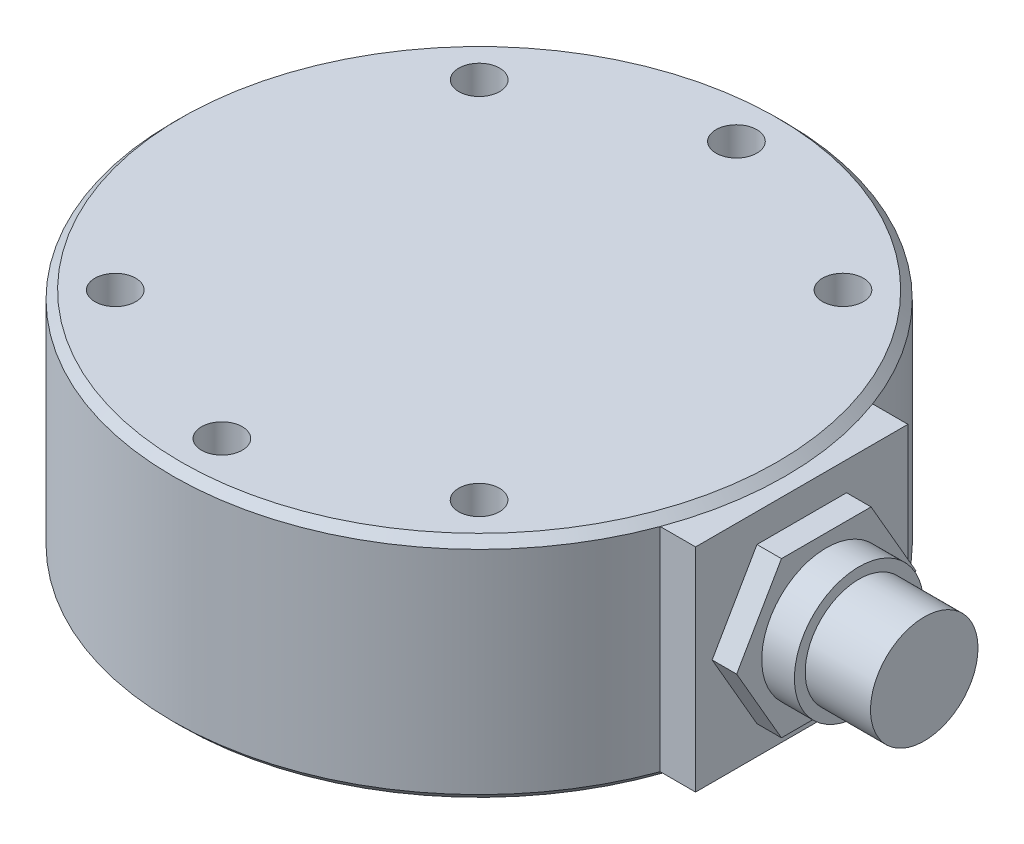
ISO-10303-21;
HEADER;
FILE_DESCRIPTION(('STEP AP214'),'2;1');
FILE_NAME('part.step','',(''),(''),'','','');
FILE_SCHEMA(('AUTOMOTIVE_DESIGN { 1 0 10303 214 1 1 1 1 }'));
ENDSEC;
DATA;
#1=APPLICATION_CONTEXT('core data for automotive mechanical design processes');
#2=APPLICATION_PROTOCOL_DEFINITION('international standard','automotive_design',2000,#1);
#3=PRODUCT_CONTEXT('',#1,'mechanical');
#4=PRODUCT('Part','Part','',(#3));
#5=PRODUCT_RELATED_PRODUCT_CATEGORY('part','',(#4));
#6=PRODUCT_DEFINITION_FORMATION('','',#4);
#7=PRODUCT_DEFINITION_CONTEXT('part definition',#1,'design');
#8=PRODUCT_DEFINITION('design','',#6,#7);
#9=PRODUCT_DEFINITION_SHAPE('','',#8);
#10=(LENGTH_UNIT() NAMED_UNIT(*) SI_UNIT(.MILLI.,.METRE.));
#11=(NAMED_UNIT(*) PLANE_ANGLE_UNIT() SI_UNIT($,.RADIAN.));
#12=(NAMED_UNIT(*) SI_UNIT($,.STERADIAN.) SOLID_ANGLE_UNIT());
#13=UNCERTAINTY_MEASURE_WITH_UNIT(LENGTH_MEASURE(1.E-05),#10,'distance_accuracy_value','');
#14=(GEOMETRIC_REPRESENTATION_CONTEXT(3) GLOBAL_UNCERTAINTY_ASSIGNED_CONTEXT((#13)) GLOBAL_UNIT_ASSIGNED_CONTEXT((#10,
#11,#12)) REPRESENTATION_CONTEXT('',''));
#15=CARTESIAN_POINT('',(0.,0.,0.));
#16=DIRECTION('',(0.,0.,1.));
#17=DIRECTION('',(1.,0.,0.));
#18=AXIS2_PLACEMENT_3D('',#15,#16,#17);
#19=CARTESIAN_POINT('',(0.,28.,0.));
#20=DIRECTION('',(0.,-1.,0.));
#21=DIRECTION('',(0.,0.,-1.));
#22=AXIS2_PLACEMENT_3D('',#19,#20,#21);
#23=CYLINDRICAL_SURFACE('',#22,37.5);
#24=CARTESIAN_POINT('',(0.,0.999999999999987,0.));
#25=DIRECTION('',(0.,1.,0.));
#26=DIRECTION('',(0.,0.,1.));
#27=AXIS2_PLACEMENT_3D('',#24,#25,#26);
#28=CIRCLE('',#27,37.5);
#29=CARTESIAN_POINT('',(35.1745646739231,0.999999999999987,-13.));
#30=VERTEX_POINT('',#29);
#31=CARTESIAN_POINT('',(35.1745646739231,0.999999999999987,13.));
#32=VERTEX_POINT('',#31);
#33=EDGE_CURVE('E177',#30,#32,#28,.T.);
#34=ORIENTED_EDGE('',*,*,#33,.T.);
#35=DIRECTION('',(0.,-1.,0.));
#36=VECTOR('',#35,1.);
#37=CARTESIAN_POINT('',(35.1745646739231,28.,13.));
#38=LINE('',#37,#36);
#39=CARTESIAN_POINT('',(35.1745646739231,27.,13.));
#40=VERTEX_POINT('',#39);
#41=EDGE_CURVE('E170',#40,#32,#38,.T.);
#42=ORIENTED_EDGE('',*,*,#41,.F.);
#43=CARTESIAN_POINT('',(0.,27.,0.));
#44=DIRECTION('',(0.,1.,0.));
#45=DIRECTION('',(0.,0.,1.));
#46=AXIS2_PLACEMENT_3D('',#43,#44,#45);
#47=CIRCLE('',#46,37.5);
#48=CARTESIAN_POINT('',(35.1745646739231,27.,-13.));
#49=VERTEX_POINT('',#48);
#50=EDGE_CURVE('E173',#40,#49,#47,.F.);
#51=ORIENTED_EDGE('',*,*,#50,.T.);
#52=DIRECTION('',(0.,-1.,0.));
#53=VECTOR('',#52,1.);
#54=CARTESIAN_POINT('',(35.1745646739231,28.,-13.));
#55=LINE('',#54,#53);
#56=EDGE_CURVE('E162',#30,#49,#55,.F.);
#57=ORIENTED_EDGE('',*,*,#56,.F.);
#58=EDGE_LOOP('',(#34,#42,#51,#57));
#59=FACE_BOUND('',#58,.T.);
#60=ADVANCED_FACE('F42',(#59),#23,.T.);
#61=CARTESIAN_POINT('',(0.,28.,0.));
#62=DIRECTION('',(0.,1.,0.));
#63=DIRECTION('',(0.,0.,1.));
#64=AXIS2_PLACEMENT_3D('',#61,#62,#63);
#65=PLANE('',#64);
#66=CARTESIAN_POINT('',(0.,28.,-31.5));
#67=DIRECTION('',(0.,1.,0.));
#68=DIRECTION('',(0.,0.,1.));
#69=AXIS2_PLACEMENT_3D('',#66,#67,#68);
#70=CIRCLE('',#69,2.5);
#71=CARTESIAN_POINT('',(0.,28.,-29.));
#72=VERTEX_POINT('',#71);
#73=EDGE_CURVE('E506',#72,#72,#70,.T.);
#74=ORIENTED_EDGE('',*,*,#73,.F.);
#75=EDGE_LOOP('',(#74));
#76=FACE_BOUND('',#75,.T.);
#77=CARTESIAN_POINT('',(22.27,28.,-22.2777265446903));
#78=DIRECTION('',(0.,1.,0.));
#79=DIRECTION('',(0.,0.,1.));
#80=AXIS2_PLACEMENT_3D('',#77,#78,#79);
#81=CIRCLE('',#80,2.5);
#82=CARTESIAN_POINT('',(22.27,28.,-19.7777265446903));
#83=VERTEX_POINT('',#82);
#84=EDGE_CURVE('E518',#83,#83,#81,.T.);
#85=ORIENTED_EDGE('',*,*,#84,.F.);
#86=EDGE_LOOP('',(#85));
#87=FACE_BOUND('',#86,.T.);
#88=CARTESIAN_POINT('',(-22.27,28.,-22.2777265446903));
#89=DIRECTION('',(0.,1.,0.));
#90=DIRECTION('',(0.,0.,1.));
#91=AXIS2_PLACEMENT_3D('',#88,#89,#90);
#92=CIRCLE('',#91,2.5);
#93=CARTESIAN_POINT('',(-22.27,28.,-19.7777265446903));
#94=VERTEX_POINT('',#93);
#95=EDGE_CURVE('E517',#94,#94,#92,.T.);
#96=ORIENTED_EDGE('',*,*,#95,.F.);
#97=EDGE_LOOP('',(#96));
#98=FACE_BOUND('',#97,.T.);
#99=CARTESIAN_POINT('',(-22.27,28.,22.2777265446903));
#100=DIRECTION('',(0.,1.,0.));
#101=DIRECTION('',(0.,0.,1.));
#102=AXIS2_PLACEMENT_3D('',#99,#100,#101);
#103=CIRCLE('',#102,2.5);
#104=CARTESIAN_POINT('',(-22.27,28.,24.7777265446903));
#105=VERTEX_POINT('',#104);
#106=EDGE_CURVE('E535',#105,#105,#103,.T.);
#107=ORIENTED_EDGE('',*,*,#106,.F.);
#108=EDGE_LOOP('',(#107));
#109=FACE_BOUND('',#108,.T.);
#110=CARTESIAN_POINT('',(22.27,28.,22.2777265446903));
#111=DIRECTION('',(0.,1.,0.));
#112=DIRECTION('',(0.,0.,1.));
#113=AXIS2_PLACEMENT_3D('',#110,#111,#112);
#114=CIRCLE('',#113,2.5);
#115=CARTESIAN_POINT('',(22.27,28.,24.7777265446903));
#116=VERTEX_POINT('',#115);
#117=EDGE_CURVE('E529',#116,#116,#114,.T.);
#118=ORIENTED_EDGE('',*,*,#117,.F.);
#119=EDGE_LOOP('',(#118));
#120=FACE_BOUND('',#119,.T.);
#121=CARTESIAN_POINT('',(0.,28.,31.5));
#122=DIRECTION('',(0.,1.,0.));
#123=DIRECTION('',(0.,0.,1.));
#124=AXIS2_PLACEMENT_3D('',#121,#122,#123);
#125=CIRCLE('',#124,2.5);
#126=CARTESIAN_POINT('',(0.,28.,34.));
#127=VERTEX_POINT('',#126);
#128=EDGE_CURVE('E523',#127,#127,#125,.T.);
#129=ORIENTED_EDGE('',*,*,#128,.F.);
#130=EDGE_LOOP('',(#129));
#131=FACE_BOUND('',#130,.T.);
#132=CARTESIAN_POINT('',(0.,28.,0.));
#133=DIRECTION('',(0.,1.,0.));
#134=DIRECTION('',(0.,0.,1.));
#135=AXIS2_PLACEMENT_3D('',#132,#133,#134);
#136=CIRCLE('',#135,36.5);
#137=CARTESIAN_POINT('',(0.,28.,36.5));
#138=VERTEX_POINT('',#137);
#139=EDGE_CURVE('E47',#138,#138,#136,.T.);
#140=ORIENTED_EDGE('',*,*,#139,.T.);
#141=EDGE_LOOP('',(#140));
#142=FACE_BOUND('',#141,.T.);
#143=ADVANCED_FACE('F246',(#76,#87,#98,#109,#120,#131,#142),#65,.T.);
#144=CARTESIAN_POINT('',(0.,0.,0.));
#145=DIRECTION('',(0.,1.,0.));
#146=DIRECTION('',(0.,0.,1.));
#147=AXIS2_PLACEMENT_3D('',#144,#145,#146);
#148=PLANE('',#147);
#149=CARTESIAN_POINT('',(0.,0.,0.));
#150=DIRECTION('',(0.,1.,0.));
#151=DIRECTION('',(0.,0.,1.));
#152=AXIS2_PLACEMENT_3D('',#149,#150,#151);
#153=CIRCLE('',#152,36.5);
#154=CARTESIAN_POINT('',(0.,0.,36.5));
#155=VERTEX_POINT('',#154);
#156=EDGE_CURVE('E180',#155,#155,#153,.F.);
#157=ORIENTED_EDGE('',*,*,#156,.T.);
#158=EDGE_LOOP('',(#157));
#159=FACE_BOUND('',#158,.T.);
#160=ADVANCED_FACE('F252',(#159),#148,.F.);
#161=CARTESIAN_POINT('',(0.,0.999999999999987,0.));
#162=DIRECTION('',(0.,1.,0.));
#163=DIRECTION('',(0.,0.,1.));
#164=AXIS2_PLACEMENT_3D('',#161,#162,#163);
#165=CONICAL_SURFACE('',#164,37.5,0.785398163397452);
#166=ORIENTED_EDGE('',*,*,#156,.F.);
#167=EDGE_LOOP('',(#166));
#168=FACE_BOUND('',#167,.T.);
#169=EDGE_CURVE('E178',#32,#30,#28,.T.);
#170=ORIENTED_EDGE('',*,*,#169,.F.);
#171=ORIENTED_EDGE('',*,*,#33,.F.);
#172=EDGE_LOOP('',(#170,#171));
#173=FACE_BOUND('',#172,.T.);
#174=ADVANCED_FACE('F257',(#168,#173),#165,.T.);
#175=CARTESIAN_POINT('',(0.,28.,0.));
#176=DIRECTION('',(0.,-1.,0.));
#177=DIRECTION('',(0.,0.,-1.));
#178=AXIS2_PLACEMENT_3D('',#175,#176,#177);
#179=CONICAL_SURFACE('',#178,36.5,0.785398163397441);
#180=EDGE_CURVE('E174',#49,#40,#47,.F.);
#181=ORIENTED_EDGE('',*,*,#180,.F.);
#182=ORIENTED_EDGE('',*,*,#50,.F.);
#183=EDGE_LOOP('',(#181,#182));
#184=FACE_BOUND('',#183,.T.);
#185=ORIENTED_EDGE('',*,*,#139,.F.);
#186=EDGE_LOOP('',(#185));
#187=FACE_BOUND('',#186,.T.);
#188=ADVANCED_FACE('F45',(#184,#187),#179,.T.);
#189=CARTESIAN_POINT('',(-37.502,1.,13.));
#190=DIRECTION('',(0.,-1.,0.));
#191=DIRECTION('',(0.,0.,-1.));
#192=AXIS2_PLACEMENT_3D('',#189,#190,#191);
#193=PLANE('',#192);
#194=DIRECTION('',(1.,0.,0.));
#195=VECTOR('',#194,1.);
#196=CARTESIAN_POINT('',(-37.502,1.,13.));
#197=LINE('',#196,#195);
#198=CARTESIAN_POINT('',(39.5,1.,13.));
#199=VERTEX_POINT('',#198);
#200=EDGE_CURVE('E160',#32,#199,#197,.T.);
#201=ORIENTED_EDGE('',*,*,#200,.F.);
#202=ORIENTED_EDGE('',*,*,#169,.T.);
#203=DIRECTION('',(1.,0.,0.));
#204=VECTOR('',#203,1.);
#205=CARTESIAN_POINT('',(-37.502,1.,-13.));
#206=LINE('',#205,#204);
#207=CARTESIAN_POINT('',(39.5,1.,-13.));
#208=VERTEX_POINT('',#207);
#209=EDGE_CURVE('E163',#30,#208,#206,.T.);
#210=ORIENTED_EDGE('',*,*,#209,.T.);
#211=DIRECTION('',(0.,0.,-1.));
#212=VECTOR('',#211,1.);
#213=CARTESIAN_POINT('',(39.5,1.,13.));
#214=LINE('',#213,#212);
#215=EDGE_CURVE('E145',#199,#208,#214,.T.);
#216=ORIENTED_EDGE('',*,*,#215,.F.);
#217=EDGE_LOOP('',(#201,#202,#210,#216));
#218=FACE_BOUND('',#217,.T.);
#219=ADVANCED_FACE('F266',(#218),#193,.T.);
#220=CARTESIAN_POINT('',(39.5,0.,0.));
#221=DIRECTION('',(1.,0.,0.));
#222=DIRECTION('',(0.,0.,-1.));
#223=AXIS2_PLACEMENT_3D('',#220,#221,#222);
#224=PLANE('',#223);
#225=DIRECTION('',(0.,0.866025403784439,-0.5));
#226=VECTOR('',#225,1.);
#227=CARTESIAN_POINT('',(39.5,4.4997013204847,-5.485));
#228=LINE('',#227,#226);
#229=CARTESIAN_POINT('',(39.5,4.4997013204847,-5.485));
#230=VERTEX_POINT('',#229);
#231=CARTESIAN_POINT('',(39.5,14.,-10.97));
#232=VERTEX_POINT('',#231);
#233=EDGE_CURVE('E60',#230,#232,#228,.T.);
#234=ORIENTED_EDGE('',*,*,#233,.F.);
#235=DIRECTION('',(0.,0.,-1.));
#236=VECTOR('',#235,1.);
#237=CARTESIAN_POINT('',(39.5,4.4997013204847,5.485));
#238=LINE('',#237,#236);
#239=CARTESIAN_POINT('',(39.5,4.4997013204847,5.485));
#240=VERTEX_POINT('',#239);
#241=EDGE_CURVE('E64',#240,#230,#238,.T.);
#242=ORIENTED_EDGE('',*,*,#241,.F.);
#243=DIRECTION('',(0.,-0.866025403784439,-0.5));
#244=VECTOR('',#243,1.);
#245=CARTESIAN_POINT('',(39.5,14.,10.97));
#246=LINE('',#245,#244);
#247=CARTESIAN_POINT('',(39.5,14.,10.97));
#248=VERTEX_POINT('',#247);
#249=EDGE_CURVE('E210',#248,#240,#246,.T.);
#250=ORIENTED_EDGE('',*,*,#249,.F.);
#251=DIRECTION('',(0.,-0.866025403784439,0.5));
#252=VECTOR('',#251,1.);
#253=CARTESIAN_POINT('',(39.5,23.5002986795153,5.485));
#254=LINE('',#253,#252);
#255=CARTESIAN_POINT('',(39.5,23.5002986795153,5.485));
#256=VERTEX_POINT('',#255);
#257=EDGE_CURVE('E207',#256,#248,#254,.T.);
#258=ORIENTED_EDGE('',*,*,#257,.F.);
#259=DIRECTION('',(0.,0.,1.));
#260=VECTOR('',#259,1.);
#261=CARTESIAN_POINT('',(39.5,23.5002986795153,-5.485));
#262=LINE('',#261,#260);
#263=CARTESIAN_POINT('',(39.5,23.5002986795153,-5.485));
#264=VERTEX_POINT('',#263);
#265=EDGE_CURVE('E204',#264,#256,#262,.T.);
#266=ORIENTED_EDGE('',*,*,#265,.F.);
#267=DIRECTION('',(0.,0.866025403784439,0.5));
#268=VECTOR('',#267,1.);
#269=CARTESIAN_POINT('',(39.5,14.,-10.97));
#270=LINE('',#269,#268);
#271=EDGE_CURVE('E202',#232,#264,#270,.T.);
#272=ORIENTED_EDGE('',*,*,#271,.F.);
#273=EDGE_LOOP('',(#234,#242,#250,#258,#266,#272));
#274=FACE_BOUND('',#273,.T.);
#275=DIRECTION('',(0.,-1.,0.));
#276=VECTOR('',#275,1.);
#277=CARTESIAN_POINT('',(39.5,27.,13.));
#278=LINE('',#277,#276);
#279=CARTESIAN_POINT('',(39.5,27.,13.));
#280=VERTEX_POINT('',#279);
#281=EDGE_CURVE('E142',#280,#199,#278,.T.);
#282=ORIENTED_EDGE('',*,*,#281,.T.);
#283=ORIENTED_EDGE('',*,*,#215,.T.);
#284=DIRECTION('',(0.,1.,0.));
#285=VECTOR('',#284,1.);
#286=CARTESIAN_POINT('',(39.5,27.,-13.));
#287=LINE('',#286,#285);
#288=CARTESIAN_POINT('',(39.5,27.,-13.));
#289=VERTEX_POINT('',#288);
#290=EDGE_CURVE('E152',#208,#289,#287,.T.);
#291=ORIENTED_EDGE('',*,*,#290,.T.);
#292=DIRECTION('',(0.,0.,1.));
#293=VECTOR('',#292,1.);
#294=CARTESIAN_POINT('',(39.5,27.,13.));
#295=LINE('',#294,#293);
#296=EDGE_CURVE('E154',#289,#280,#295,.T.);
#297=ORIENTED_EDGE('',*,*,#296,.T.);
#298=EDGE_LOOP('',(#282,#283,#291,#297));
#299=FACE_BOUND('',#298,.T.);
#300=ADVANCED_FACE('F227',(#274,#299),#224,.T.);
#301=CARTESIAN_POINT('',(-37.502,27.,13.));
#302=DIRECTION('',(0.,0.,1.));
#303=DIRECTION('',(0.,-1.,0.));
#304=AXIS2_PLACEMENT_3D('',#301,#302,#303);
#305=PLANE('',#304);
#306=DIRECTION('',(1.,0.,0.));
#307=VECTOR('',#306,1.);
#308=CARTESIAN_POINT('',(-37.502,27.,13.));
#309=LINE('',#308,#307);
#310=EDGE_CURVE('E157',#40,#280,#309,.T.);
#311=ORIENTED_EDGE('',*,*,#310,.F.);
#312=ORIENTED_EDGE('',*,*,#41,.T.);
#313=ORIENTED_EDGE('',*,*,#200,.T.);
#314=ORIENTED_EDGE('',*,*,#281,.F.);
#315=EDGE_LOOP('',(#311,#312,#313,#314));
#316=FACE_BOUND('',#315,.T.);
#317=ADVANCED_FACE('F278',(#316),#305,.T.);
#318=CARTESIAN_POINT('',(-37.502,27.,-13.));
#319=DIRECTION('',(0.,0.,-1.));
#320=DIRECTION('',(0.,1.,0.));
#321=AXIS2_PLACEMENT_3D('',#318,#319,#320);
#322=PLANE('',#321);
#323=ORIENTED_EDGE('',*,*,#209,.F.);
#324=ORIENTED_EDGE('',*,*,#56,.T.);
#325=DIRECTION('',(1.,0.,0.));
#326=VECTOR('',#325,1.);
#327=CARTESIAN_POINT('',(-37.502,27.,-13.));
#328=LINE('',#327,#326);
#329=EDGE_CURVE('E165',#49,#289,#328,.T.);
#330=ORIENTED_EDGE('',*,*,#329,.T.);
#331=ORIENTED_EDGE('',*,*,#290,.F.);
#332=EDGE_LOOP('',(#323,#324,#330,#331));
#333=FACE_BOUND('',#332,.T.);
#334=ADVANCED_FACE('F288',(#333),#322,.T.);
#335=CARTESIAN_POINT('',(-37.502,27.,13.));
#336=DIRECTION('',(0.,1.,0.));
#337=DIRECTION('',(0.,0.,1.));
#338=AXIS2_PLACEMENT_3D('',#335,#336,#337);
#339=PLANE('',#338);
#340=ORIENTED_EDGE('',*,*,#329,.F.);
#341=ORIENTED_EDGE('',*,*,#180,.T.);
#342=ORIENTED_EDGE('',*,*,#310,.T.);
#343=ORIENTED_EDGE('',*,*,#296,.F.);
#344=EDGE_LOOP('',(#340,#341,#342,#343));
#345=FACE_BOUND('',#344,.T.);
#346=ADVANCED_FACE('F268',(#345),#339,.T.);
#347=CARTESIAN_POINT('',(42.5,4.4997013204847,-5.485));
#348=DIRECTION('',(0.,0.5,0.866025403784439));
#349=DIRECTION('',(0.,-0.866025403784439,0.5));
#350=AXIS2_PLACEMENT_3D('',#347,#348,#349);
#351=PLANE('',#350);
#352=ORIENTED_EDGE('',*,*,#233,.T.);
#353=DIRECTION('',(-1.,0.,0.));
#354=VECTOR('',#353,1.);
#355=CARTESIAN_POINT('',(42.5,14.,-10.97));
#356=LINE('',#355,#354);
#357=CARTESIAN_POINT('',(42.5,14.,-10.97));
#358=VERTEX_POINT('',#357);
#359=EDGE_CURVE('E125',#358,#232,#356,.T.);
#360=ORIENTED_EDGE('',*,*,#359,.F.);
#361=DIRECTION('',(0.,0.866025403784439,-0.5));
#362=VECTOR('',#361,1.);
#363=CARTESIAN_POINT('',(42.5,4.4997013204847,-5.485));
#364=LINE('',#363,#362);
#365=CARTESIAN_POINT('',(42.5,4.4997013204847,-5.485));
#366=VERTEX_POINT('',#365);
#367=EDGE_CURVE('E131',#366,#358,#364,.T.);
#368=ORIENTED_EDGE('',*,*,#367,.F.);
#369=DIRECTION('',(-1.,0.,0.));
#370=VECTOR('',#369,1.);
#371=CARTESIAN_POINT('',(42.5,4.4997013204847,-5.485));
#372=LINE('',#371,#370);
#373=EDGE_CURVE('E200',#366,#230,#372,.T.);
#374=ORIENTED_EDGE('',*,*,#373,.T.);
#375=EDGE_LOOP('',(#352,#360,#368,#374));
#376=FACE_BOUND('',#375,.T.);
#377=ADVANCED_FACE('F141',(#376),#351,.F.);
#378=CARTESIAN_POINT('',(42.5,14.,-10.97));
#379=DIRECTION('',(0.,-0.5,0.866025403784439));
#380=DIRECTION('',(0.,-0.866025403784439,-0.5));
#381=AXIS2_PLACEMENT_3D('',#378,#379,#380);
#382=PLANE('',#381);
#383=ORIENTED_EDGE('',*,*,#271,.T.);
#384=DIRECTION('',(-1.,0.,0.));
#385=VECTOR('',#384,1.);
#386=CARTESIAN_POINT('',(42.5,23.5002986795153,-5.485));
#387=LINE('',#386,#385);
#388=CARTESIAN_POINT('',(42.5,23.5002986795153,-5.485));
#389=VERTEX_POINT('',#388);
#390=EDGE_CURVE('E127',#389,#264,#387,.T.);
#391=ORIENTED_EDGE('',*,*,#390,.F.);
#392=DIRECTION('',(0.,0.866025403784439,0.5));
#393=VECTOR('',#392,1.);
#394=CARTESIAN_POINT('',(42.5,14.,-10.97));
#395=LINE('',#394,#393);
#396=EDGE_CURVE('E120',#358,#389,#395,.T.);
#397=ORIENTED_EDGE('',*,*,#396,.F.);
#398=ORIENTED_EDGE('',*,*,#359,.T.);
#399=EDGE_LOOP('',(#383,#391,#397,#398));
#400=FACE_BOUND('',#399,.T.);
#401=ADVANCED_FACE('F123',(#400),#382,.F.);
#402=CARTESIAN_POINT('',(42.5,23.5002986795153,-5.485));
#403=DIRECTION('',(0.,-1.,0.));
#404=DIRECTION('',(0.,0.,-1.));
#405=AXIS2_PLACEMENT_3D('',#402,#403,#404);
#406=PLANE('',#405);
#407=ORIENTED_EDGE('',*,*,#265,.T.);
#408=DIRECTION('',(-1.,0.,0.));
#409=VECTOR('',#408,1.);
#410=CARTESIAN_POINT('',(42.5,23.5002986795153,5.485));
#411=LINE('',#410,#409);
#412=CARTESIAN_POINT('',(42.5,23.5002986795153,5.485));
#413=VERTEX_POINT('',#412);
#414=EDGE_CURVE('E147',#413,#256,#411,.T.);
#415=ORIENTED_EDGE('',*,*,#414,.F.);
#416=DIRECTION('',(0.,0.,1.));
#417=VECTOR('',#416,1.);
#418=CARTESIAN_POINT('',(42.5,23.5002986795153,-5.485));
#419=LINE('',#418,#417);
#420=EDGE_CURVE('E130',#389,#413,#419,.T.);
#421=ORIENTED_EDGE('',*,*,#420,.F.);
#422=ORIENTED_EDGE('',*,*,#390,.T.);
#423=EDGE_LOOP('',(#407,#415,#421,#422));
#424=FACE_BOUND('',#423,.T.);
#425=ADVANCED_FACE('F226',(#424),#406,.F.);
#426=CARTESIAN_POINT('',(42.5,23.5002986795153,5.485));
#427=DIRECTION('',(0.,-0.5,-0.866025403784439));
#428=DIRECTION('',(0.,0.866025403784439,-0.5));
#429=AXIS2_PLACEMENT_3D('',#426,#427,#428);
#430=PLANE('',#429);
#431=ORIENTED_EDGE('',*,*,#257,.T.);
#432=DIRECTION('',(-1.,0.,0.));
#433=VECTOR('',#432,1.);
#434=CARTESIAN_POINT('',(42.5,14.,10.97));
#435=LINE('',#434,#433);
#436=CARTESIAN_POINT('',(42.5,14.,10.97));
#437=VERTEX_POINT('',#436);
#438=EDGE_CURVE('E217',#437,#248,#435,.T.);
#439=ORIENTED_EDGE('',*,*,#438,.F.);
#440=DIRECTION('',(0.,-0.866025403784439,0.5));
#441=VECTOR('',#440,1.);
#442=CARTESIAN_POINT('',(42.5,23.5002986795153,5.485));
#443=LINE('',#442,#441);
#444=EDGE_CURVE('E195',#413,#437,#443,.T.);
#445=ORIENTED_EDGE('',*,*,#444,.F.);
#446=ORIENTED_EDGE('',*,*,#414,.T.);
#447=EDGE_LOOP('',(#431,#439,#445,#446));
#448=FACE_BOUND('',#447,.T.);
#449=ADVANCED_FACE('F223',(#448),#430,.F.);
#450=CARTESIAN_POINT('',(42.5,14.,10.97));
#451=DIRECTION('',(0.,0.5,-0.866025403784439));
#452=DIRECTION('',(0.,0.866025403784439,0.5));
#453=AXIS2_PLACEMENT_3D('',#450,#451,#452);
#454=PLANE('',#453);
#455=ORIENTED_EDGE('',*,*,#249,.T.);
#456=DIRECTION('',(-1.,0.,0.));
#457=VECTOR('',#456,1.);
#458=CARTESIAN_POINT('',(42.5,4.4997013204847,5.485));
#459=LINE('',#458,#457);
#460=CARTESIAN_POINT('',(42.5,4.4997013204847,5.485));
#461=VERTEX_POINT('',#460);
#462=EDGE_CURVE('E214',#461,#240,#459,.T.);
#463=ORIENTED_EDGE('',*,*,#462,.F.);
#464=DIRECTION('',(0.,-0.866025403784439,-0.5));
#465=VECTOR('',#464,1.);
#466=CARTESIAN_POINT('',(42.5,14.,10.97));
#467=LINE('',#466,#465);
#468=EDGE_CURVE('E197',#437,#461,#467,.T.);
#469=ORIENTED_EDGE('',*,*,#468,.F.);
#470=ORIENTED_EDGE('',*,*,#438,.T.);
#471=EDGE_LOOP('',(#455,#463,#469,#470));
#472=FACE_BOUND('',#471,.T.);
#473=ADVANCED_FACE('F231',(#472),#454,.F.);
#474=CARTESIAN_POINT('',(42.5,4.4997013204847,5.485));
#475=DIRECTION('',(0.,1.,0.));
#476=DIRECTION('',(0.,0.,1.));
#477=AXIS2_PLACEMENT_3D('',#474,#475,#476);
#478=PLANE('',#477);
#479=ORIENTED_EDGE('',*,*,#241,.T.);
#480=ORIENTED_EDGE('',*,*,#373,.F.);
#481=DIRECTION('',(0.,0.,-1.));
#482=VECTOR('',#481,1.);
#483=CARTESIAN_POINT('',(42.5,4.4997013204847,5.485));
#484=LINE('',#483,#482);
#485=EDGE_CURVE('E136',#461,#366,#484,.T.);
#486=ORIENTED_EDGE('',*,*,#485,.F.);
#487=ORIENTED_EDGE('',*,*,#462,.T.);
#488=EDGE_LOOP('',(#479,#480,#486,#487));
#489=FACE_BOUND('',#488,.T.);
#490=ADVANCED_FACE('F234',(#489),#478,.F.);
#491=CARTESIAN_POINT('',(42.5,0.,0.));
#492=DIRECTION('',(1.,0.,0.));
#493=DIRECTION('',(0.,0.,-1.));
#494=AXIS2_PLACEMENT_3D('',#491,#492,#493);
#495=PLANE('',#494);
#496=CARTESIAN_POINT('',(42.5,14.,0.));
#497=DIRECTION('',(1.,0.,0.));
#498=DIRECTION('',(0.,0.,-1.));
#499=AXIS2_PLACEMENT_3D('',#496,#497,#498);
#500=CIRCLE('',#499,7.9);
#501=CARTESIAN_POINT('',(42.5,14.,-7.89999999999999));
#502=VERTEX_POINT('',#501);
#503=EDGE_CURVE('E52',#502,#502,#500,.T.);
#504=ORIENTED_EDGE('',*,*,#503,.F.);
#505=EDGE_LOOP('',(#504));
#506=FACE_BOUND('',#505,.T.);
#507=ORIENTED_EDGE('',*,*,#367,.T.);
#508=ORIENTED_EDGE('',*,*,#396,.T.);
#509=ORIENTED_EDGE('',*,*,#420,.T.);
#510=ORIENTED_EDGE('',*,*,#444,.T.);
#511=ORIENTED_EDGE('',*,*,#468,.T.);
#512=ORIENTED_EDGE('',*,*,#485,.T.);
#513=EDGE_LOOP('',(#507,#508,#509,#510,#511,#512));
#514=FACE_BOUND('',#513,.T.);
#515=ADVANCED_FACE('F134',(#506,#514),#495,.T.);
#516=CARTESIAN_POINT('',(46.5,14.,0.));
#517=DIRECTION('',(-1.,0.,0.));
#518=DIRECTION('',(0.,0.,1.));
#519=AXIS2_PLACEMENT_3D('',#516,#517,#518);
#520=CYLINDRICAL_SURFACE('',#519,7.9);
#521=CARTESIAN_POINT('',(46.5,14.,0.));
#522=DIRECTION('',(1.,0.,0.));
#523=DIRECTION('',(0.,0.,-1.));
#524=AXIS2_PLACEMENT_3D('',#521,#522,#523);
#525=CIRCLE('',#524,7.9);
#526=CARTESIAN_POINT('',(46.5,14.,-7.89999999999999));
#527=VERTEX_POINT('',#526);
#528=EDGE_CURVE('E192',#527,#527,#525,.T.);
#529=ORIENTED_EDGE('',*,*,#528,.F.);
#530=EDGE_LOOP('',(#529));
#531=FACE_BOUND('',#530,.T.);
#532=ORIENTED_EDGE('',*,*,#503,.T.);
#533=EDGE_LOOP('',(#532));
#534=FACE_BOUND('',#533,.T.);
#535=ADVANCED_FACE('F241',(#531,#534),#520,.T.);
#536=CARTESIAN_POINT('',(46.5,14.,0.));
#537=DIRECTION('',(1.,0.,0.));
#538=DIRECTION('',(0.,0.,-1.));
#539=AXIS2_PLACEMENT_3D('',#536,#537,#538);
#540=PLANE('',#539);
#541=CARTESIAN_POINT('',(46.5,14.,0.));
#542=DIRECTION('',(1.,0.,0.));
#543=DIRECTION('',(0.,0.,-1.));
#544=AXIS2_PLACEMENT_3D('',#541,#542,#543);
#545=CIRCLE('',#544,6.58);
#546=CARTESIAN_POINT('',(46.5,14.,-6.57999999999999));
#547=VERTEX_POINT('',#546);
#548=EDGE_CURVE('E11',#547,#547,#545,.T.);
#549=ORIENTED_EDGE('',*,*,#548,.F.);
#550=EDGE_LOOP('',(#549));
#551=FACE_BOUND('',#550,.T.);
#552=ORIENTED_EDGE('',*,*,#528,.T.);
#553=EDGE_LOOP('',(#552));
#554=FACE_BOUND('',#553,.T.);
#555=ADVANCED_FACE('F340',(#551,#554),#540,.T.);
#556=CARTESIAN_POINT('',(54.5,14.,0.));
#557=DIRECTION('',(-1.,0.,0.));
#558=DIRECTION('',(0.,0.,1.));
#559=AXIS2_PLACEMENT_3D('',#556,#557,#558);
#560=CYLINDRICAL_SURFACE('',#559,6.58);
#561=CARTESIAN_POINT('',(54.5,14.,0.));
#562=DIRECTION('',(1.,0.,0.));
#563=DIRECTION('',(0.,0.,-1.));
#564=AXIS2_PLACEMENT_3D('',#561,#562,#563);
#565=CIRCLE('',#564,6.58);
#566=CARTESIAN_POINT('',(54.5,14.,-6.57999999999999));
#567=VERTEX_POINT('',#566);
#568=EDGE_CURVE('E505',#567,#567,#565,.T.);
#569=ORIENTED_EDGE('',*,*,#568,.F.);
#570=EDGE_LOOP('',(#569));
#571=FACE_BOUND('',#570,.T.);
#572=ORIENTED_EDGE('',*,*,#548,.T.);
#573=EDGE_LOOP('',(#572));
#574=FACE_BOUND('',#573,.T.);
#575=ADVANCED_FACE('F350',(#571,#574),#560,.T.);
#576=CARTESIAN_POINT('',(54.5,14.,0.));
#577=DIRECTION('',(1.,0.,0.));
#578=DIRECTION('',(0.,0.,-1.));
#579=AXIS2_PLACEMENT_3D('',#576,#577,#578);
#580=PLANE('',#579);
#581=ORIENTED_EDGE('',*,*,#568,.T.);
#582=EDGE_LOOP('',(#581));
#583=FACE_BOUND('',#582,.T.);
#584=ADVANCED_FACE('F360',(#583),#580,.T.);
#585=CARTESIAN_POINT('',(0.,23.,31.5));
#586=DIRECTION('',(0.,1.,0.));
#587=DIRECTION('',(0.,0.,1.));
#588=AXIS2_PLACEMENT_3D('',#585,#586,#587);
#589=CYLINDRICAL_SURFACE('',#588,2.5);
#590=CARTESIAN_POINT('',(0.,23.,31.5));
#591=DIRECTION('',(0.,1.,0.));
#592=DIRECTION('',(0.,0.,1.));
#593=AXIS2_PLACEMENT_3D('',#590,#591,#592);
#594=CIRCLE('',#593,2.5);
#595=CARTESIAN_POINT('',(0.,23.,34.));
#596=VERTEX_POINT('',#595);
#597=EDGE_CURVE('E511',#596,#596,#594,.T.);
#598=ORIENTED_EDGE('',*,*,#597,.F.);
#599=EDGE_LOOP('',(#598));
#600=FACE_BOUND('',#599,.T.);
#601=ORIENTED_EDGE('',*,*,#128,.T.);
#602=EDGE_LOOP('',(#601));
#603=FACE_BOUND('',#602,.T.);
#604=ADVANCED_FACE('F370',(#600,#603),#589,.F.);
#605=CARTESIAN_POINT('',(0.,23.,31.5));
#606=DIRECTION('',(0.,1.,0.));
#607=DIRECTION('',(0.,0.,1.));
#608=AXIS2_PLACEMENT_3D('',#605,#606,#607);
#609=PLANE('',#608);
#610=ORIENTED_EDGE('',*,*,#597,.T.);
#611=EDGE_LOOP('',(#610));
#612=FACE_BOUND('',#611,.T.);
#613=ADVANCED_FACE('F388',(#612),#609,.T.);
#614=CARTESIAN_POINT('',(22.27,23.,22.2777265446903));
#615=DIRECTION('',(0.,1.,0.));
#616=DIRECTION('',(0.,0.,1.));
#617=AXIS2_PLACEMENT_3D('',#614,#615,#616);
#618=CYLINDRICAL_SURFACE('',#617,2.5);
#619=CARTESIAN_POINT('',(22.27,23.,22.2777265446903));
#620=DIRECTION('',(0.,1.,0.));
#621=DIRECTION('',(0.,0.,1.));
#622=AXIS2_PLACEMENT_3D('',#619,#620,#621);
#623=CIRCLE('',#622,2.5);
#624=CARTESIAN_POINT('',(22.27,23.,24.7777265446903));
#625=VERTEX_POINT('',#624);
#626=EDGE_CURVE('E526',#625,#625,#623,.T.);
#627=ORIENTED_EDGE('',*,*,#626,.F.);
#628=EDGE_LOOP('',(#627));
#629=FACE_BOUND('',#628,.T.);
#630=ORIENTED_EDGE('',*,*,#117,.T.);
#631=EDGE_LOOP('',(#630));
#632=FACE_BOUND('',#631,.T.);
#633=ADVANCED_FACE('F398',(#629,#632),#618,.F.);
#634=CARTESIAN_POINT('',(22.27,23.,22.2777265446903));
#635=DIRECTION('',(0.,1.,0.));
#636=DIRECTION('',(0.,0.,1.));
#637=AXIS2_PLACEMENT_3D('',#634,#635,#636);
#638=PLANE('',#637);
#639=ORIENTED_EDGE('',*,*,#626,.T.);
#640=EDGE_LOOP('',(#639));
#641=FACE_BOUND('',#640,.T.);
#642=ADVANCED_FACE('F408',(#641),#638,.T.);
#643=CARTESIAN_POINT('',(-22.27,23.,22.2777265446903));
#644=DIRECTION('',(0.,1.,0.));
#645=DIRECTION('',(0.,0.,1.));
#646=AXIS2_PLACEMENT_3D('',#643,#644,#645);
#647=CYLINDRICAL_SURFACE('',#646,2.5);
#648=CARTESIAN_POINT('',(-22.27,23.,22.2777265446903));
#649=DIRECTION('',(0.,1.,0.));
#650=DIRECTION('',(0.,0.,1.));
#651=AXIS2_PLACEMENT_3D('',#648,#649,#650);
#652=CIRCLE('',#651,2.5);
#653=CARTESIAN_POINT('',(-22.27,23.,24.7777265446903));
#654=VERTEX_POINT('',#653);
#655=EDGE_CURVE('E532',#654,#654,#652,.T.);
#656=ORIENTED_EDGE('',*,*,#655,.F.);
#657=EDGE_LOOP('',(#656));
#658=FACE_BOUND('',#657,.T.);
#659=ORIENTED_EDGE('',*,*,#106,.T.);
#660=EDGE_LOOP('',(#659));
#661=FACE_BOUND('',#660,.T.);
#662=ADVANCED_FACE('F418',(#658,#661),#647,.F.);
#663=CARTESIAN_POINT('',(-22.27,23.,22.2777265446903));
#664=DIRECTION('',(0.,1.,0.));
#665=DIRECTION('',(0.,0.,1.));
#666=AXIS2_PLACEMENT_3D('',#663,#664,#665);
#667=PLANE('',#666);
#668=ORIENTED_EDGE('',*,*,#655,.T.);
#669=EDGE_LOOP('',(#668));
#670=FACE_BOUND('',#669,.T.);
#671=ADVANCED_FACE('F428',(#670),#667,.T.);
#672=CARTESIAN_POINT('',(-22.27,23.,-22.2777265446903));
#673=DIRECTION('',(0.,1.,0.));
#674=DIRECTION('',(0.,0.,1.));
#675=AXIS2_PLACEMENT_3D('',#672,#673,#674);
#676=CYLINDRICAL_SURFACE('',#675,2.5);
#677=CARTESIAN_POINT('',(-22.27,23.,-22.2777265446903));
#678=DIRECTION('',(0.,1.,0.));
#679=DIRECTION('',(0.,0.,1.));
#680=AXIS2_PLACEMENT_3D('',#677,#678,#679);
#681=CIRCLE('',#680,2.5);
#682=CARTESIAN_POINT('',(-22.27,23.,-19.7777265446903));
#683=VERTEX_POINT('',#682);
#684=EDGE_CURVE('E538',#683,#683,#681,.T.);
#685=ORIENTED_EDGE('',*,*,#684,.F.);
#686=EDGE_LOOP('',(#685));
#687=FACE_BOUND('',#686,.T.);
#688=ORIENTED_EDGE('',*,*,#95,.T.);
#689=EDGE_LOOP('',(#688));
#690=FACE_BOUND('',#689,.T.);
#691=ADVANCED_FACE('F438',(#687,#690),#676,.F.);
#692=CARTESIAN_POINT('',(-22.27,23.,-22.2777265446903));
#693=DIRECTION('',(0.,1.,0.));
#694=DIRECTION('',(0.,0.,1.));
#695=AXIS2_PLACEMENT_3D('',#692,#693,#694);
#696=PLANE('',#695);
#697=ORIENTED_EDGE('',*,*,#684,.T.);
#698=EDGE_LOOP('',(#697));
#699=FACE_BOUND('',#698,.T.);
#700=ADVANCED_FACE('F448',(#699),#696,.T.);
#701=CARTESIAN_POINT('',(22.27,23.,-22.2777265446903));
#702=DIRECTION('',(0.,1.,0.));
#703=DIRECTION('',(0.,0.,1.));
#704=AXIS2_PLACEMENT_3D('',#701,#702,#703);
#705=CYLINDRICAL_SURFACE('',#704,2.5);
#706=CARTESIAN_POINT('',(22.27,23.,-22.2777265446903));
#707=DIRECTION('',(0.,1.,0.));
#708=DIRECTION('',(0.,0.,1.));
#709=AXIS2_PLACEMENT_3D('',#706,#707,#708);
#710=CIRCLE('',#709,2.5);
#711=CARTESIAN_POINT('',(22.27,23.,-19.7777265446903));
#712=VERTEX_POINT('',#711);
#713=EDGE_CURVE('E514',#712,#712,#710,.T.);
#714=ORIENTED_EDGE('',*,*,#713,.F.);
#715=EDGE_LOOP('',(#714));
#716=FACE_BOUND('',#715,.T.);
#717=ORIENTED_EDGE('',*,*,#84,.T.);
#718=EDGE_LOOP('',(#717));
#719=FACE_BOUND('',#718,.T.);
#720=ADVANCED_FACE('F458',(#716,#719),#705,.F.);
#721=CARTESIAN_POINT('',(22.27,23.,-22.2777265446903));
#722=DIRECTION('',(0.,1.,0.));
#723=DIRECTION('',(0.,0.,1.));
#724=AXIS2_PLACEMENT_3D('',#721,#722,#723);
#725=PLANE('',#724);
#726=ORIENTED_EDGE('',*,*,#713,.T.);
#727=EDGE_LOOP('',(#726));
#728=FACE_BOUND('',#727,.T.);
#729=ADVANCED_FACE('F468',(#728),#725,.T.);
#730=CARTESIAN_POINT('',(0.,23.,-31.5));
#731=DIRECTION('',(0.,1.,0.));
#732=DIRECTION('',(0.,0.,1.));
#733=AXIS2_PLACEMENT_3D('',#730,#731,#732);
#734=CYLINDRICAL_SURFACE('',#733,2.5);
#735=CARTESIAN_POINT('',(0.,23.,-31.5));
#736=DIRECTION('',(0.,1.,0.));
#737=DIRECTION('',(0.,0.,1.));
#738=AXIS2_PLACEMENT_3D('',#735,#736,#737);
#739=CIRCLE('',#738,2.5);
#740=CARTESIAN_POINT('',(0.,23.,-29.));
#741=VERTEX_POINT('',#740);
#742=EDGE_CURVE('E504',#741,#741,#739,.T.);
#743=ORIENTED_EDGE('',*,*,#742,.F.);
#744=EDGE_LOOP('',(#743));
#745=FACE_BOUND('',#744,.T.);
#746=ORIENTED_EDGE('',*,*,#73,.T.);
#747=EDGE_LOOP('',(#746));
#748=FACE_BOUND('',#747,.T.);
#749=ADVANCED_FACE('F478',(#745,#748),#734,.F.);
#750=CARTESIAN_POINT('',(0.,23.,-31.5));
#751=DIRECTION('',(0.,1.,0.));
#752=DIRECTION('',(0.,0.,1.));
#753=AXIS2_PLACEMENT_3D('',#750,#751,#752);
#754=PLANE('',#753);
#755=ORIENTED_EDGE('',*,*,#742,.T.);
#756=EDGE_LOOP('',(#755));
#757=FACE_BOUND('',#756,.T.);
#758=ADVANCED_FACE('F488',(#757),#754,.T.);
#759=CLOSED_SHELL('',(#60,#143,#160,#174,#188,#219,#300,#317,#334,#346,#377,#401,#425,#449,#473,
#490,#515,#535,#555,#575,#584,#604,#613,#633,#642,#662,#671,#691,#700,#720,#729,#749,#758));
#760=MANIFOLD_SOLID_BREP('B2',#759);
#761=ADVANCED_BREP_SHAPE_REPRESENTATION('',(#18,#760),#14);
#762=SHAPE_DEFINITION_REPRESENTATION(#9,#761);
ENDSEC;
END-ISO-10303-21;
